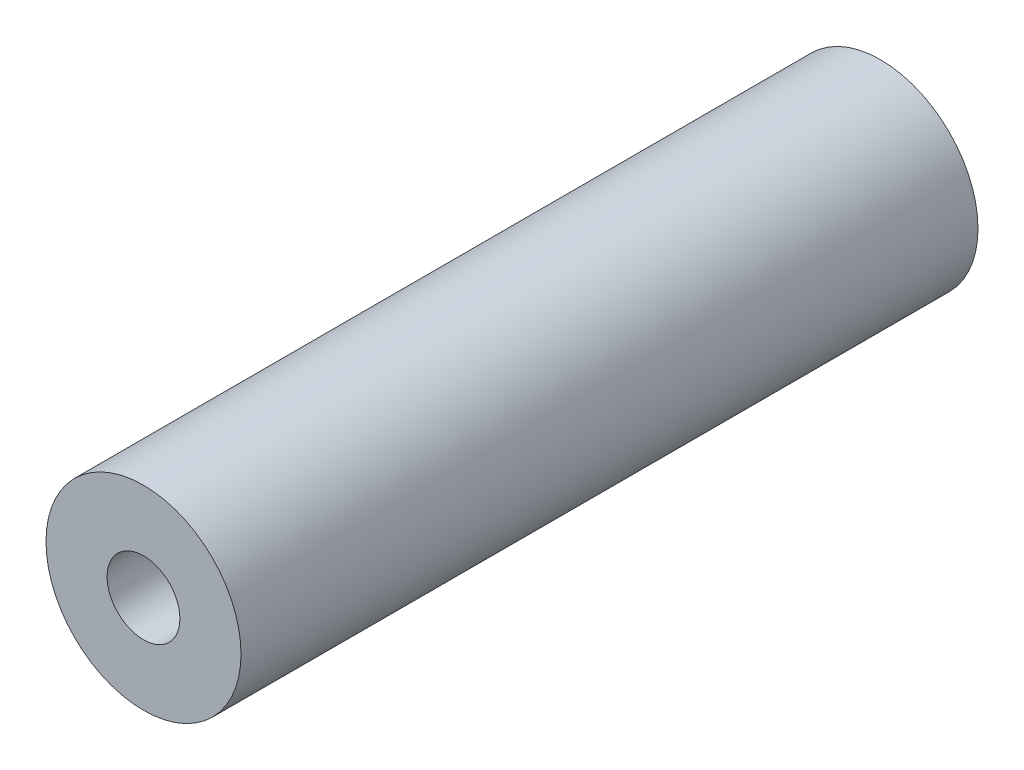
ISO-10303-21;
HEADER;
FILE_DESCRIPTION(('STEP AP214'),'2;1');
FILE_NAME('part.step','',(''),(''),'','','');
FILE_SCHEMA(('AUTOMOTIVE_DESIGN { 1 0 10303 214 1 1 1 1 }'));
ENDSEC;
DATA;
#1=APPLICATION_CONTEXT('core data for automotive mechanical design processes');
#2=APPLICATION_PROTOCOL_DEFINITION('international standard','automotive_design',2000,#1);
#3=PRODUCT_CONTEXT('',#1,'mechanical');
#4=PRODUCT('Part','Part','',(#3));
#5=PRODUCT_RELATED_PRODUCT_CATEGORY('part','',(#4));
#6=PRODUCT_DEFINITION_FORMATION('','',#4);
#7=PRODUCT_DEFINITION_CONTEXT('part definition',#1,'design');
#8=PRODUCT_DEFINITION('design','',#6,#7);
#9=PRODUCT_DEFINITION_SHAPE('','',#8);
#10=(LENGTH_UNIT() NAMED_UNIT(*) SI_UNIT(.MILLI.,.METRE.));
#11=(NAMED_UNIT(*) PLANE_ANGLE_UNIT() SI_UNIT($,.RADIAN.));
#12=(NAMED_UNIT(*) SI_UNIT($,.STERADIAN.) SOLID_ANGLE_UNIT());
#13=UNCERTAINTY_MEASURE_WITH_UNIT(LENGTH_MEASURE(1.E-05),#10,'distance_accuracy_value','');
#14=(GEOMETRIC_REPRESENTATION_CONTEXT(3) GLOBAL_UNCERTAINTY_ASSIGNED_CONTEXT((#13)) GLOBAL_UNIT_ASSIGNED_CONTEXT((#10,
#11,#12)) REPRESENTATION_CONTEXT('',''));
#15=CARTESIAN_POINT('',(0.,0.,0.));
#16=DIRECTION('',(0.,0.,1.));
#17=DIRECTION('',(1.,0.,0.));
#18=AXIS2_PLACEMENT_3D('',#15,#16,#17);
#19=CARTESIAN_POINT('',(0.,0.,18.));
#20=DIRECTION('',(0.,0.,-1.));
#21=DIRECTION('',(-1.,0.,0.));
#22=AXIS2_PLACEMENT_3D('',#19,#20,#21);
#23=CYLINDRICAL_SURFACE('',#22,2.38125);
#24=CARTESIAN_POINT('',(0.,0.,18.));
#25=DIRECTION('',(0.,0.,1.));
#26=DIRECTION('',(1.,0.,0.));
#27=AXIS2_PLACEMENT_3D('',#24,#25,#26);
#28=CIRCLE('',#27,2.38125);
#29=CARTESIAN_POINT('',(2.38125,0.,18.));
#30=VERTEX_POINT('',#29);
#31=EDGE_CURVE('E10',#30,#30,#28,.T.);
#32=ORIENTED_EDGE('',*,*,#31,.F.);
#33=EDGE_LOOP('',(#32));
#34=FACE_BOUND('',#33,.T.);
#35=CARTESIAN_POINT('',(0.,0.,0.));
#36=DIRECTION('',(0.,0.,1.));
#37=DIRECTION('',(1.,0.,0.));
#38=AXIS2_PLACEMENT_3D('',#35,#36,#37);
#39=CIRCLE('',#38,2.38125);
#40=CARTESIAN_POINT('',(2.38125,0.,0.));
#41=VERTEX_POINT('',#40);
#42=EDGE_CURVE('E40',#41,#41,#39,.T.);
#43=ORIENTED_EDGE('',*,*,#42,.T.);
#44=EDGE_LOOP('',(#43));
#45=FACE_BOUND('',#44,.T.);
#46=ADVANCED_FACE('F37',(#34,#45),#23,.T.);
#47=CARTESIAN_POINT('',(0.,0.,18.));
#48=DIRECTION('',(0.,0.,1.));
#49=DIRECTION('',(1.,0.,0.));
#50=AXIS2_PLACEMENT_3D('',#47,#48,#49);
#51=PLANE('',#50);
#52=CARTESIAN_POINT('',(0.,0.,18.));
#53=DIRECTION('',(0.,0.,1.));
#54=DIRECTION('',(1.,0.,0.));
#55=AXIS2_PLACEMENT_3D('',#52,#53,#54);
#56=CIRCLE('',#55,0.888999999999987);
#57=CARTESIAN_POINT('',(0.888999999999987,0.,18.));
#58=VERTEX_POINT('',#57);
#59=EDGE_CURVE('E51',#58,#58,#56,.T.);
#60=ORIENTED_EDGE('',*,*,#59,.F.);
#61=EDGE_LOOP('',(#60));
#62=FACE_BOUND('',#61,.T.);
#63=ORIENTED_EDGE('',*,*,#31,.T.);
#64=EDGE_LOOP('',(#63));
#65=FACE_BOUND('',#64,.T.);
#66=ADVANCED_FACE('F57',(#62,#65),#51,.T.);
#67=CARTESIAN_POINT('',(0.,0.,0.));
#68=DIRECTION('',(0.,0.,1.));
#69=DIRECTION('',(1.,0.,0.));
#70=AXIS2_PLACEMENT_3D('',#67,#68,#69);
#71=PLANE('',#70);
#72=CARTESIAN_POINT('',(0.,0.,0.));
#73=DIRECTION('',(0.,0.,1.));
#74=DIRECTION('',(1.,0.,0.));
#75=AXIS2_PLACEMENT_3D('',#72,#73,#74);
#76=CIRCLE('',#75,0.888999999999995);
#77=CARTESIAN_POINT('',(0.888999999999995,0.,0.));
#78=VERTEX_POINT('',#77);
#79=EDGE_CURVE('E47',#78,#78,#76,.T.);
#80=ORIENTED_EDGE('',*,*,#79,.T.);
#81=EDGE_LOOP('',(#80));
#82=FACE_BOUND('',#81,.T.);
#83=ORIENTED_EDGE('',*,*,#42,.F.);
#84=EDGE_LOOP('',(#83));
#85=FACE_BOUND('',#84,.T.);
#86=ADVANCED_FACE('F59',(#82,#85),#71,.F.);
#87=CARTESIAN_POINT('',(0.,0.,18.));
#88=DIRECTION('',(0.,0.,1.));
#89=DIRECTION('',(1.,0.,0.));
#90=AXIS2_PLACEMENT_3D('',#87,#88,#89);
#91=CYLINDRICAL_SURFACE('',#90,0.888999999999991);
#92=ORIENTED_EDGE('',*,*,#79,.F.);
#93=EDGE_LOOP('',(#92));
#94=FACE_BOUND('',#93,.T.);
#95=ORIENTED_EDGE('',*,*,#59,.T.);
#96=EDGE_LOOP('',(#95));
#97=FACE_BOUND('',#96,.T.);
#98=ADVANCED_FACE('F55',(#94,#97),#91,.F.);
#99=CLOSED_SHELL('',(#46,#66,#86,#98));
#100=MANIFOLD_SOLID_BREP('B2',#99);
#101=ADVANCED_BREP_SHAPE_REPRESENTATION('',(#18,#100),#14);
#102=SHAPE_DEFINITION_REPRESENTATION(#9,#101);
ENDSEC;
END-ISO-10303-21;
